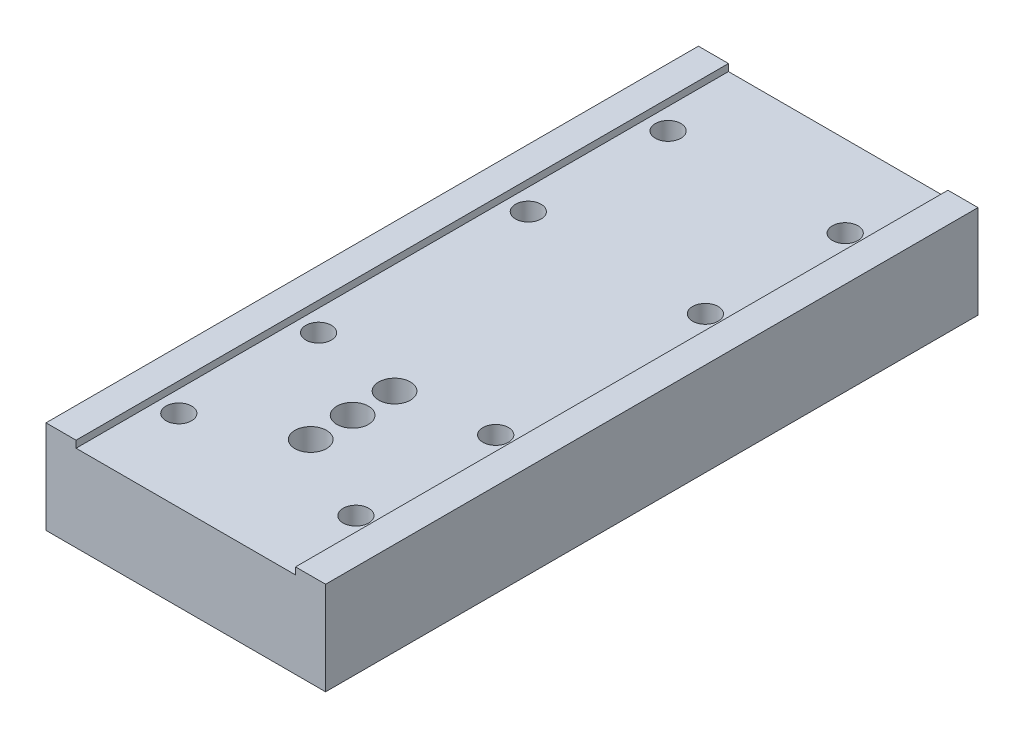
ISO-10303-21;
HEADER;
FILE_DESCRIPTION(('STEP AP214'),'2;1');
FILE_NAME('part.step','',(''),(''),'','','');
FILE_SCHEMA(('AUTOMOTIVE_DESIGN { 1 0 10303 214 1 1 1 1 }'));
ENDSEC;
DATA;
#1=APPLICATION_CONTEXT('core data for automotive mechanical design processes');
#2=APPLICATION_PROTOCOL_DEFINITION('international standard','automotive_design',2000,#1);
#3=PRODUCT_CONTEXT('',#1,'mechanical');
#4=PRODUCT('Part','Part','',(#3));
#5=PRODUCT_RELATED_PRODUCT_CATEGORY('part','',(#4));
#6=PRODUCT_DEFINITION_FORMATION('','',#4);
#7=PRODUCT_DEFINITION_CONTEXT('part definition',#1,'design');
#8=PRODUCT_DEFINITION('design','',#6,#7);
#9=PRODUCT_DEFINITION_SHAPE('','',#8);
#10=(LENGTH_UNIT() NAMED_UNIT(*) SI_UNIT(.MILLI.,.METRE.));
#11=(NAMED_UNIT(*) PLANE_ANGLE_UNIT() SI_UNIT($,.RADIAN.));
#12=(NAMED_UNIT(*) SI_UNIT($,.STERADIAN.) SOLID_ANGLE_UNIT());
#13=UNCERTAINTY_MEASURE_WITH_UNIT(LENGTH_MEASURE(1.E-05),#10,'distance_accuracy_value','');
#14=(GEOMETRIC_REPRESENTATION_CONTEXT(3) GLOBAL_UNCERTAINTY_ASSIGNED_CONTEXT((#13)) GLOBAL_UNIT_ASSIGNED_CONTEXT((#10,
#11,#12)) REPRESENTATION_CONTEXT('',''));
#15=CARTESIAN_POINT('',(0.,0.,0.));
#16=DIRECTION('',(0.,0.,1.));
#17=DIRECTION('',(1.,0.,0.));
#18=AXIS2_PLACEMENT_3D('',#15,#16,#17);
#19=CARTESIAN_POINT('',(0.,0.,43.2));
#20=DIRECTION('',(0.,-1.,0.));
#21=DIRECTION('',(0.,0.,-1.));
#22=AXIS2_PLACEMENT_3D('',#19,#20,#21);
#23=CONICAL_SURFACE('',#22,4.025,0.785398163397446);
#24=CARTESIAN_POINT('',(0.,0.625000000000014,43.2));
#25=DIRECTION('',(0.,-1.,0.));
#26=DIRECTION('',(0.,0.,-1.));
#27=AXIS2_PLACEMENT_3D('',#24,#25,#26);
#28=CIRCLE('',#27,3.4);
#29=CARTESIAN_POINT('',(0.,0.625000000000014,39.8));
#30=VERTEX_POINT('',#29);
#31=EDGE_CURVE('E11',#30,#30,#28,.T.);
#32=ORIENTED_EDGE('',*,*,#31,.F.);
#33=EDGE_LOOP('',(#32));
#34=FACE_BOUND('',#33,.T.);
#35=CARTESIAN_POINT('',(0.,0.,43.2));
#36=DIRECTION('',(0.,-1.,0.));
#37=DIRECTION('',(0.,0.,-1.));
#38=AXIS2_PLACEMENT_3D('',#35,#36,#37);
#39=CIRCLE('',#38,4.025);
#40=CARTESIAN_POINT('',(0.,0.,39.175));
#41=VERTEX_POINT('',#40);
#42=EDGE_CURVE('E1143',#41,#41,#39,.T.);
#43=ORIENTED_EDGE('',*,*,#42,.T.);
#44=EDGE_LOOP('',(#43));
#45=FACE_BOUND('',#44,.T.);
#46=ADVANCED_FACE('F17',(#34,#45),#23,.F.);
#47=CARTESIAN_POINT('',(0.,0.,43.2));
#48=DIRECTION('',(0.,-1.,0.));
#49=DIRECTION('',(0.,0.,-1.));
#50=AXIS2_PLACEMENT_3D('',#47,#48,#49);
#51=CYLINDRICAL_SURFACE('',#50,3.4);
#52=ORIENTED_EDGE('',*,*,#31,.T.);
#53=EDGE_LOOP('',(#52));
#54=FACE_BOUND('',#53,.T.);
#55=CARTESIAN_POINT('',(0.,18.5,43.2));
#56=DIRECTION('',(0.,-1.,0.));
#57=DIRECTION('',(0.,0.,-1.));
#58=AXIS2_PLACEMENT_3D('',#55,#56,#57);
#59=CIRCLE('',#58,3.4);
#60=CARTESIAN_POINT('',(0.,18.5,39.8));
#61=VERTEX_POINT('',#60);
#62=EDGE_CURVE('E1178',#61,#61,#59,.T.);
#63=ORIENTED_EDGE('',*,*,#62,.F.);
#64=EDGE_LOOP('',(#63));
#65=FACE_BOUND('',#64,.T.);
#66=ADVANCED_FACE('F693',(#54,#65),#51,.F.);
#67=CARTESIAN_POINT('',(0.,0.,25.2));
#68=DIRECTION('',(0.,-1.,0.));
#69=DIRECTION('',(0.,0.,-1.));
#70=AXIS2_PLACEMENT_3D('',#67,#68,#69);
#71=CONICAL_SURFACE('',#70,4.025,0.785398163397446);
#72=CARTESIAN_POINT('',(0.,0.625000000000014,25.2));
#73=DIRECTION('',(0.,-1.,0.));
#74=DIRECTION('',(0.,0.,-1.));
#75=AXIS2_PLACEMENT_3D('',#72,#73,#74);
#76=CIRCLE('',#75,3.4);
#77=CARTESIAN_POINT('',(0.,0.625000000000014,21.8));
#78=VERTEX_POINT('',#77);
#79=EDGE_CURVE('E20',#78,#78,#76,.T.);
#80=ORIENTED_EDGE('',*,*,#79,.F.);
#81=EDGE_LOOP('',(#80));
#82=FACE_BOUND('',#81,.T.);
#83=CARTESIAN_POINT('',(0.,0.,25.2));
#84=DIRECTION('',(0.,-1.,0.));
#85=DIRECTION('',(0.,0.,-1.));
#86=AXIS2_PLACEMENT_3D('',#83,#84,#85);
#87=CIRCLE('',#86,4.025);
#88=CARTESIAN_POINT('',(0.,0.,21.175));
#89=VERTEX_POINT('',#88);
#90=EDGE_CURVE('E1146',#89,#89,#87,.T.);
#91=ORIENTED_EDGE('',*,*,#90,.T.);
#92=EDGE_LOOP('',(#91));
#93=FACE_BOUND('',#92,.T.);
#94=ADVANCED_FACE('F683',(#82,#93),#71,.F.);
#95=CARTESIAN_POINT('',(0.,0.,25.2));
#96=DIRECTION('',(0.,-1.,0.));
#97=DIRECTION('',(0.,0.,-1.));
#98=AXIS2_PLACEMENT_3D('',#95,#96,#97);
#99=CYLINDRICAL_SURFACE('',#98,3.4);
#100=ORIENTED_EDGE('',*,*,#79,.T.);
#101=EDGE_LOOP('',(#100));
#102=FACE_BOUND('',#101,.T.);
#103=CARTESIAN_POINT('',(0.,18.5,25.2));
#104=DIRECTION('',(0.,-1.,0.));
#105=DIRECTION('',(0.,0.,-1.));
#106=AXIS2_PLACEMENT_3D('',#103,#104,#105);
#107=CIRCLE('',#106,3.4);
#108=CARTESIAN_POINT('',(0.,18.5,21.8));
#109=VERTEX_POINT('',#108);
#110=EDGE_CURVE('E1180',#109,#109,#107,.T.);
#111=ORIENTED_EDGE('',*,*,#110,.F.);
#112=EDGE_LOOP('',(#111));
#113=FACE_BOUND('',#112,.T.);
#114=ADVANCED_FACE('F672',(#102,#113),#99,.F.);
#115=CARTESIAN_POINT('',(0.,0.,34.2));
#116=DIRECTION('',(0.,-1.,0.));
#117=DIRECTION('',(0.,0.,-1.));
#118=AXIS2_PLACEMENT_3D('',#115,#116,#117);
#119=CONICAL_SURFACE('',#118,4.025,0.785398163397446);
#120=CARTESIAN_POINT('',(0.,0.625000000000014,34.2));
#121=DIRECTION('',(0.,-1.,0.));
#122=DIRECTION('',(0.,0.,-1.));
#123=AXIS2_PLACEMENT_3D('',#120,#121,#122);
#124=CIRCLE('',#123,3.4);
#125=CARTESIAN_POINT('',(0.,0.625000000000014,30.8));
#126=VERTEX_POINT('',#125);
#127=EDGE_CURVE('E265',#126,#126,#124,.T.);
#128=ORIENTED_EDGE('',*,*,#127,.F.);
#129=EDGE_LOOP('',(#128));
#130=FACE_BOUND('',#129,.T.);
#131=CARTESIAN_POINT('',(0.,0.,34.2));
#132=DIRECTION('',(0.,-1.,0.));
#133=DIRECTION('',(0.,0.,-1.));
#134=AXIS2_PLACEMENT_3D('',#131,#132,#133);
#135=CIRCLE('',#134,4.025);
#136=CARTESIAN_POINT('',(0.,0.,30.175));
#137=VERTEX_POINT('',#136);
#138=EDGE_CURVE('E1149',#137,#137,#135,.T.);
#139=ORIENTED_EDGE('',*,*,#138,.T.);
#140=EDGE_LOOP('',(#139));
#141=FACE_BOUND('',#140,.T.);
#142=ADVANCED_FACE('F662',(#130,#141),#119,.F.);
#143=CARTESIAN_POINT('',(0.,0.,34.2));
#144=DIRECTION('',(0.,-1.,0.));
#145=DIRECTION('',(0.,0.,-1.));
#146=AXIS2_PLACEMENT_3D('',#143,#144,#145);
#147=CYLINDRICAL_SURFACE('',#146,3.4);
#148=ORIENTED_EDGE('',*,*,#127,.T.);
#149=EDGE_LOOP('',(#148));
#150=FACE_BOUND('',#149,.T.);
#151=CARTESIAN_POINT('',(0.,18.5,34.2));
#152=DIRECTION('',(0.,-1.,0.));
#153=DIRECTION('',(0.,0.,-1.));
#154=AXIS2_PLACEMENT_3D('',#151,#152,#153);
#155=CIRCLE('',#154,3.4);
#156=CARTESIAN_POINT('',(0.,18.5,30.8));
#157=VERTEX_POINT('',#156);
#158=EDGE_CURVE('E1188',#157,#157,#155,.T.);
#159=ORIENTED_EDGE('',*,*,#158,.F.);
#160=EDGE_LOOP('',(#159));
#161=FACE_BOUND('',#160,.T.);
#162=ADVANCED_FACE('F651',(#150,#161),#147,.F.);
#163=CARTESIAN_POINT('',(-19.,0.,52.5));
#164=DIRECTION('',(0.,-1.,0.));
#165=DIRECTION('',(0.,0.,-1.));
#166=AXIS2_PLACEMENT_3D('',#163,#164,#165);
#167=CYLINDRICAL_SURFACE('',#166,5.5);
#168=CARTESIAN_POINT('',(-19.,10.,52.5));
#169=DIRECTION('',(0.,-1.,0.));
#170=DIRECTION('',(0.,0.,-1.));
#171=AXIS2_PLACEMENT_3D('',#168,#169,#170);
#172=CIRCLE('',#171,5.5);
#173=CARTESIAN_POINT('',(-19.,10.,47.));
#174=VERTEX_POINT('',#173);
#175=EDGE_CURVE('E80',#174,#174,#172,.T.);
#176=ORIENTED_EDGE('',*,*,#175,.F.);
#177=EDGE_LOOP('',(#176));
#178=FACE_BOUND('',#177,.T.);
#179=CARTESIAN_POINT('',(-19.,0.,52.5));
#180=DIRECTION('',(0.,-1.,0.));
#181=DIRECTION('',(0.,0.,-1.));
#182=AXIS2_PLACEMENT_3D('',#179,#180,#181);
#183=CIRCLE('',#182,5.5);
#184=CARTESIAN_POINT('',(-19.,0.,47.));
#185=VERTEX_POINT('',#184);
#186=EDGE_CURVE('E1155',#185,#185,#183,.T.);
#187=ORIENTED_EDGE('',*,*,#186,.T.);
#188=EDGE_LOOP('',(#187));
#189=FACE_BOUND('',#188,.T.);
#190=ADVANCED_FACE('F640',(#178,#189),#167,.F.);
#191=CARTESIAN_POINT('',(-16.25,10.,52.5));
#192=DIRECTION('',(0.,1.,0.));
#193=DIRECTION('',(1.,0.,0.));
#194=AXIS2_PLACEMENT_3D('',#191,#192,#193);
#195=PLANE('',#194);
#196=CARTESIAN_POINT('',(-19.,10.,52.5));
#197=DIRECTION('',(0.,-1.,0.));
#198=DIRECTION('',(0.,0.,-1.));
#199=AXIS2_PLACEMENT_3D('',#196,#197,#198);
#200=CIRCLE('',#199,2.75);
#201=CARTESIAN_POINT('',(-19.,10.,49.75));
#202=VERTEX_POINT('',#201);
#203=EDGE_CURVE('E90',#202,#202,#200,.T.);
#204=ORIENTED_EDGE('',*,*,#203,.F.);
#205=EDGE_LOOP('',(#204));
#206=FACE_BOUND('',#205,.T.);
#207=ORIENTED_EDGE('',*,*,#175,.T.);
#208=EDGE_LOOP('',(#207));
#209=FACE_BOUND('',#208,.T.);
#210=ADVANCED_FACE('F631',(#206,#209),#195,.F.);
#211=CARTESIAN_POINT('',(-19.,0.,52.5));
#212=DIRECTION('',(0.,-1.,0.));
#213=DIRECTION('',(0.,0.,-1.));
#214=AXIS2_PLACEMENT_3D('',#211,#212,#213);
#215=CYLINDRICAL_SURFACE('',#214,2.75);
#216=ORIENTED_EDGE('',*,*,#203,.T.);
#217=EDGE_LOOP('',(#216));
#218=FACE_BOUND('',#217,.T.);
#219=CARTESIAN_POINT('',(-19.,18.5,52.5));
#220=DIRECTION('',(0.,-1.,0.));
#221=DIRECTION('',(0.,0.,-1.));
#222=AXIS2_PLACEMENT_3D('',#219,#220,#221);
#223=CIRCLE('',#222,2.75);
#224=CARTESIAN_POINT('',(-19.,18.5,49.75));
#225=VERTEX_POINT('',#224);
#226=EDGE_CURVE('E1189',#225,#225,#223,.T.);
#227=ORIENTED_EDGE('',*,*,#226,.F.);
#228=EDGE_LOOP('',(#227));
#229=FACE_BOUND('',#228,.T.);
#230=ADVANCED_FACE('F620',(#218,#229),#215,.F.);
#231=CARTESIAN_POINT('',(19.,0.,22.5));
#232=DIRECTION('',(0.,-1.,0.));
#233=DIRECTION('',(0.,0.,-1.));
#234=AXIS2_PLACEMENT_3D('',#231,#232,#233);
#235=CYLINDRICAL_SURFACE('',#234,5.5);
#236=CARTESIAN_POINT('',(19.,10.,22.5));
#237=DIRECTION('',(0.,-1.,0.));
#238=DIRECTION('',(0.,0.,-1.));
#239=AXIS2_PLACEMENT_3D('',#236,#237,#238);
#240=CIRCLE('',#239,5.5);
#241=CARTESIAN_POINT('',(19.,10.,17.));
#242=VERTEX_POINT('',#241);
#243=EDGE_CURVE('E261',#242,#242,#240,.T.);
#244=ORIENTED_EDGE('',*,*,#243,.F.);
#245=EDGE_LOOP('',(#244));
#246=FACE_BOUND('',#245,.T.);
#247=CARTESIAN_POINT('',(19.,0.,22.5));
#248=DIRECTION('',(0.,-1.,0.));
#249=DIRECTION('',(0.,0.,-1.));
#250=AXIS2_PLACEMENT_3D('',#247,#248,#249);
#251=CIRCLE('',#250,5.5);
#252=CARTESIAN_POINT('',(19.,0.,17.));
#253=VERTEX_POINT('',#252);
#254=EDGE_CURVE('E1158',#253,#253,#251,.T.);
#255=ORIENTED_EDGE('',*,*,#254,.T.);
#256=EDGE_LOOP('',(#255));
#257=FACE_BOUND('',#256,.T.);
#258=ADVANCED_FACE('F609',(#246,#257),#235,.F.);
#259=CARTESIAN_POINT('',(21.75,10.,22.5));
#260=DIRECTION('',(0.,1.,0.));
#261=DIRECTION('',(1.,0.,0.));
#262=AXIS2_PLACEMENT_3D('',#259,#260,#261);
#263=PLANE('',#262);
#264=CARTESIAN_POINT('',(19.,10.,22.5));
#265=DIRECTION('',(0.,-1.,0.));
#266=DIRECTION('',(0.,0.,-1.));
#267=AXIS2_PLACEMENT_3D('',#264,#265,#266);
#268=CIRCLE('',#267,2.75);
#269=CARTESIAN_POINT('',(19.,10.,19.75));
#270=VERTEX_POINT('',#269);
#271=EDGE_CURVE('E258',#270,#270,#268,.T.);
#272=ORIENTED_EDGE('',*,*,#271,.F.);
#273=EDGE_LOOP('',(#272));
#274=FACE_BOUND('',#273,.T.);
#275=ORIENTED_EDGE('',*,*,#243,.T.);
#276=EDGE_LOOP('',(#275));
#277=FACE_BOUND('',#276,.T.);
#278=ADVANCED_FACE('F598',(#274,#277),#263,.F.);
#279=CARTESIAN_POINT('',(19.,0.,22.5));
#280=DIRECTION('',(0.,-1.,0.));
#281=DIRECTION('',(0.,0.,-1.));
#282=AXIS2_PLACEMENT_3D('',#279,#280,#281);
#283=CYLINDRICAL_SURFACE('',#282,2.75);
#284=ORIENTED_EDGE('',*,*,#271,.T.);
#285=EDGE_LOOP('',(#284));
#286=FACE_BOUND('',#285,.T.);
#287=CARTESIAN_POINT('',(19.,18.5,22.5));
#288=DIRECTION('',(0.,-1.,0.));
#289=DIRECTION('',(0.,0.,-1.));
#290=AXIS2_PLACEMENT_3D('',#287,#288,#289);
#291=CIRCLE('',#290,2.75);
#292=CARTESIAN_POINT('',(19.,18.5,19.75));
#293=VERTEX_POINT('',#292);
#294=EDGE_CURVE('E1192',#293,#293,#291,.T.);
#295=ORIENTED_EDGE('',*,*,#294,.F.);
#296=EDGE_LOOP('',(#295));
#297=FACE_BOUND('',#296,.T.);
#298=ADVANCED_FACE('F587',(#286,#297),#283,.F.);
#299=CARTESIAN_POINT('',(19.,0.,52.5));
#300=DIRECTION('',(0.,-1.,0.));
#301=DIRECTION('',(0.,0.,-1.));
#302=AXIS2_PLACEMENT_3D('',#299,#300,#301);
#303=CYLINDRICAL_SURFACE('',#302,5.5);
#304=CARTESIAN_POINT('',(19.,10.,52.5));
#305=DIRECTION('',(0.,-1.,0.));
#306=DIRECTION('',(0.,0.,-1.));
#307=AXIS2_PLACEMENT_3D('',#304,#305,#306);
#308=CIRCLE('',#307,5.5);
#309=CARTESIAN_POINT('',(19.,10.,47.));
#310=VERTEX_POINT('',#309);
#311=EDGE_CURVE('E257',#310,#310,#308,.T.);
#312=ORIENTED_EDGE('',*,*,#311,.F.);
#313=EDGE_LOOP('',(#312));
#314=FACE_BOUND('',#313,.T.);
#315=CARTESIAN_POINT('',(19.,0.,52.5));
#316=DIRECTION('',(0.,-1.,0.));
#317=DIRECTION('',(0.,0.,-1.));
#318=AXIS2_PLACEMENT_3D('',#315,#316,#317);
#319=CIRCLE('',#318,5.5);
#320=CARTESIAN_POINT('',(19.,0.,47.));
#321=VERTEX_POINT('',#320);
#322=EDGE_CURVE('E1159',#321,#321,#319,.T.);
#323=ORIENTED_EDGE('',*,*,#322,.T.);
#324=EDGE_LOOP('',(#323));
#325=FACE_BOUND('',#324,.T.);
#326=ADVANCED_FACE('F576',(#314,#325),#303,.F.);
#327=CARTESIAN_POINT('',(21.75,10.,52.5));
#328=DIRECTION('',(0.,1.,0.));
#329=DIRECTION('',(1.,0.,0.));
#330=AXIS2_PLACEMENT_3D('',#327,#328,#329);
#331=PLANE('',#330);
#332=CARTESIAN_POINT('',(19.,10.,52.5));
#333=DIRECTION('',(0.,-1.,0.));
#334=DIRECTION('',(0.,0.,-1.));
#335=AXIS2_PLACEMENT_3D('',#332,#333,#334);
#336=CIRCLE('',#335,2.75);
#337=CARTESIAN_POINT('',(19.,10.,49.75));
#338=VERTEX_POINT('',#337);
#339=EDGE_CURVE('E254',#338,#338,#336,.T.);
#340=ORIENTED_EDGE('',*,*,#339,.F.);
#341=EDGE_LOOP('',(#340));
#342=FACE_BOUND('',#341,.T.);
#343=ORIENTED_EDGE('',*,*,#311,.T.);
#344=EDGE_LOOP('',(#343));
#345=FACE_BOUND('',#344,.T.);
#346=ADVANCED_FACE('F566',(#342,#345),#331,.F.);
#347=CARTESIAN_POINT('',(19.,0.,52.5));
#348=DIRECTION('',(0.,-1.,0.));
#349=DIRECTION('',(0.,0.,-1.));
#350=AXIS2_PLACEMENT_3D('',#347,#348,#349);
#351=CYLINDRICAL_SURFACE('',#350,2.75);
#352=ORIENTED_EDGE('',*,*,#339,.T.);
#353=EDGE_LOOP('',(#352));
#354=FACE_BOUND('',#353,.T.);
#355=CARTESIAN_POINT('',(19.,18.5,52.5));
#356=DIRECTION('',(0.,-1.,0.));
#357=DIRECTION('',(0.,0.,-1.));
#358=AXIS2_PLACEMENT_3D('',#355,#356,#357);
#359=CIRCLE('',#358,2.75);
#360=CARTESIAN_POINT('',(19.,18.5,49.75));
#361=VERTEX_POINT('',#360);
#362=EDGE_CURVE('E1195',#361,#361,#359,.T.);
#363=ORIENTED_EDGE('',*,*,#362,.F.);
#364=EDGE_LOOP('',(#363));
#365=FACE_BOUND('',#364,.T.);
#366=ADVANCED_FACE('F556',(#354,#365),#351,.F.);
#367=CARTESIAN_POINT('',(-19.,0.,22.5));
#368=DIRECTION('',(0.,-1.,0.));
#369=DIRECTION('',(0.,0.,-1.));
#370=AXIS2_PLACEMENT_3D('',#367,#368,#369);
#371=CYLINDRICAL_SURFACE('',#370,5.5);
#372=CARTESIAN_POINT('',(-19.,10.,22.5));
#373=DIRECTION('',(0.,-1.,0.));
#374=DIRECTION('',(0.,0.,-1.));
#375=AXIS2_PLACEMENT_3D('',#372,#373,#374);
#376=CIRCLE('',#375,5.5);
#377=CARTESIAN_POINT('',(-19.,10.,17.));
#378=VERTEX_POINT('',#377);
#379=EDGE_CURVE('E251',#378,#378,#376,.T.);
#380=ORIENTED_EDGE('',*,*,#379,.F.);
#381=EDGE_LOOP('',(#380));
#382=FACE_BOUND('',#381,.T.);
#383=CARTESIAN_POINT('',(-19.,0.,22.5));
#384=DIRECTION('',(0.,-1.,0.));
#385=DIRECTION('',(0.,0.,-1.));
#386=AXIS2_PLACEMENT_3D('',#383,#384,#385);
#387=CIRCLE('',#386,5.5);
#388=CARTESIAN_POINT('',(-19.,0.,17.));
#389=VERTEX_POINT('',#388);
#390=EDGE_CURVE('E1162',#389,#389,#387,.T.);
#391=ORIENTED_EDGE('',*,*,#390,.T.);
#392=EDGE_LOOP('',(#391));
#393=FACE_BOUND('',#392,.T.);
#394=ADVANCED_FACE('F545',(#382,#393),#371,.F.);
#395=CARTESIAN_POINT('',(-16.25,10.,22.5));
#396=DIRECTION('',(0.,1.,0.));
#397=DIRECTION('',(1.,0.,0.));
#398=AXIS2_PLACEMENT_3D('',#395,#396,#397);
#399=PLANE('',#398);
#400=CARTESIAN_POINT('',(-19.,10.,22.5));
#401=DIRECTION('',(0.,-1.,0.));
#402=DIRECTION('',(0.,0.,-1.));
#403=AXIS2_PLACEMENT_3D('',#400,#401,#402);
#404=CIRCLE('',#403,2.75);
#405=CARTESIAN_POINT('',(-19.,10.,19.75));
#406=VERTEX_POINT('',#405);
#407=EDGE_CURVE('E243',#406,#406,#404,.T.);
#408=ORIENTED_EDGE('',*,*,#407,.F.);
#409=EDGE_LOOP('',(#408));
#410=FACE_BOUND('',#409,.T.);
#411=ORIENTED_EDGE('',*,*,#379,.T.);
#412=EDGE_LOOP('',(#411));
#413=FACE_BOUND('',#412,.T.);
#414=ADVANCED_FACE('F534',(#410,#413),#399,.F.);
#415=CARTESIAN_POINT('',(-19.,0.,22.5));
#416=DIRECTION('',(0.,-1.,0.));
#417=DIRECTION('',(0.,0.,-1.));
#418=AXIS2_PLACEMENT_3D('',#415,#416,#417);
#419=CYLINDRICAL_SURFACE('',#418,2.75);
#420=ORIENTED_EDGE('',*,*,#407,.T.);
#421=EDGE_LOOP('',(#420));
#422=FACE_BOUND('',#421,.T.);
#423=CARTESIAN_POINT('',(-19.,18.5,22.5));
#424=DIRECTION('',(0.,-1.,0.));
#425=DIRECTION('',(0.,0.,-1.));
#426=AXIS2_PLACEMENT_3D('',#423,#424,#425);
#427=CIRCLE('',#426,2.75);
#428=CARTESIAN_POINT('',(-19.,18.5,19.75));
#429=VERTEX_POINT('',#428);
#430=EDGE_CURVE('E1108',#429,#429,#427,.T.);
#431=ORIENTED_EDGE('',*,*,#430,.F.);
#432=EDGE_LOOP('',(#431));
#433=FACE_BOUND('',#432,.T.);
#434=ADVANCED_FACE('F523',(#422,#433),#419,.F.);
#435=CARTESIAN_POINT('',(-19.,0.,-22.5));
#436=DIRECTION('',(0.,-1.,0.));
#437=DIRECTION('',(0.,0.,-1.));
#438=AXIS2_PLACEMENT_3D('',#435,#436,#437);
#439=CYLINDRICAL_SURFACE('',#438,5.5);
#440=CARTESIAN_POINT('',(-19.,10.,-22.5));
#441=DIRECTION('',(0.,-1.,0.));
#442=DIRECTION('',(0.,0.,-1.));
#443=AXIS2_PLACEMENT_3D('',#440,#441,#442);
#444=CIRCLE('',#443,5.5);
#445=CARTESIAN_POINT('',(-19.,10.,-28.));
#446=VERTEX_POINT('',#445);
#447=EDGE_CURVE('E236',#446,#446,#444,.T.);
#448=ORIENTED_EDGE('',*,*,#447,.F.);
#449=EDGE_LOOP('',(#448));
#450=FACE_BOUND('',#449,.T.);
#451=CARTESIAN_POINT('',(-19.,0.,-22.5));
#452=DIRECTION('',(0.,-1.,0.));
#453=DIRECTION('',(0.,0.,-1.));
#454=AXIS2_PLACEMENT_3D('',#451,#452,#453);
#455=CIRCLE('',#454,5.5);
#456=CARTESIAN_POINT('',(-19.,0.,-28.));
#457=VERTEX_POINT('',#456);
#458=EDGE_CURVE('E1165',#457,#457,#455,.T.);
#459=ORIENTED_EDGE('',*,*,#458,.T.);
#460=EDGE_LOOP('',(#459));
#461=FACE_BOUND('',#460,.T.);
#462=ADVANCED_FACE('F513',(#450,#461),#439,.F.);
#463=CARTESIAN_POINT('',(-16.25,10.,-22.5));
#464=DIRECTION('',(0.,1.,0.));
#465=DIRECTION('',(1.,0.,0.));
#466=AXIS2_PLACEMENT_3D('',#463,#464,#465);
#467=PLANE('',#466);
#468=CARTESIAN_POINT('',(-19.,10.,-22.5));
#469=DIRECTION('',(0.,-1.,0.));
#470=DIRECTION('',(0.,0.,-1.));
#471=AXIS2_PLACEMENT_3D('',#468,#469,#470);
#472=CIRCLE('',#471,2.75);
#473=CARTESIAN_POINT('',(-19.,10.,-25.25));
#474=VERTEX_POINT('',#473);
#475=EDGE_CURVE('E231',#474,#474,#472,.T.);
#476=ORIENTED_EDGE('',*,*,#475,.F.);
#477=EDGE_LOOP('',(#476));
#478=FACE_BOUND('',#477,.T.);
#479=ORIENTED_EDGE('',*,*,#447,.T.);
#480=EDGE_LOOP('',(#479));
#481=FACE_BOUND('',#480,.T.);
#482=ADVANCED_FACE('F502',(#478,#481),#467,.F.);
#483=CARTESIAN_POINT('',(-19.,0.,-22.5));
#484=DIRECTION('',(0.,-1.,0.));
#485=DIRECTION('',(0.,0.,-1.));
#486=AXIS2_PLACEMENT_3D('',#483,#484,#485);
#487=CYLINDRICAL_SURFACE('',#486,2.75);
#488=ORIENTED_EDGE('',*,*,#475,.T.);
#489=EDGE_LOOP('',(#488));
#490=FACE_BOUND('',#489,.T.);
#491=CARTESIAN_POINT('',(-19.,18.5,-22.5));
#492=DIRECTION('',(0.,-1.,0.));
#493=DIRECTION('',(0.,0.,-1.));
#494=AXIS2_PLACEMENT_3D('',#491,#492,#493);
#495=CIRCLE('',#494,2.75);
#496=CARTESIAN_POINT('',(-19.,18.5,-25.25));
#497=VERTEX_POINT('',#496);
#498=EDGE_CURVE('E1105',#497,#497,#495,.T.);
#499=ORIENTED_EDGE('',*,*,#498,.F.);
#500=EDGE_LOOP('',(#499));
#501=FACE_BOUND('',#500,.T.);
#502=ADVANCED_FACE('F232',(#490,#501),#487,.F.);
#503=CARTESIAN_POINT('',(19.,0.,-52.5));
#504=DIRECTION('',(0.,-1.,0.));
#505=DIRECTION('',(0.,0.,-1.));
#506=AXIS2_PLACEMENT_3D('',#503,#504,#505);
#507=CYLINDRICAL_SURFACE('',#506,5.5);
#508=CARTESIAN_POINT('',(19.,10.,-52.5));
#509=DIRECTION('',(0.,-1.,0.));
#510=DIRECTION('',(0.,0.,-1.));
#511=AXIS2_PLACEMENT_3D('',#508,#509,#510);
#512=CIRCLE('',#511,5.5);
#513=CARTESIAN_POINT('',(19.,10.,-58.));
#514=VERTEX_POINT('',#513);
#515=EDGE_CURVE('E225',#514,#514,#512,.T.);
#516=ORIENTED_EDGE('',*,*,#515,.F.);
#517=EDGE_LOOP('',(#516));
#518=FACE_BOUND('',#517,.T.);
#519=CARTESIAN_POINT('',(19.,0.,-52.5));
#520=DIRECTION('',(0.,-1.,0.));
#521=DIRECTION('',(0.,0.,-1.));
#522=AXIS2_PLACEMENT_3D('',#519,#520,#521);
#523=CIRCLE('',#522,5.5);
#524=CARTESIAN_POINT('',(19.,0.,-58.));
#525=VERTEX_POINT('',#524);
#526=EDGE_CURVE('E1154',#525,#525,#523,.T.);
#527=ORIENTED_EDGE('',*,*,#526,.T.);
#528=EDGE_LOOP('',(#527));
#529=FACE_BOUND('',#528,.T.);
#530=ADVANCED_FACE('F481',(#518,#529),#507,.F.);
#531=CARTESIAN_POINT('',(21.75,10.,-52.5));
#532=DIRECTION('',(0.,1.,0.));
#533=DIRECTION('',(1.,0.,0.));
#534=AXIS2_PLACEMENT_3D('',#531,#532,#533);
#535=PLANE('',#534);
#536=CARTESIAN_POINT('',(19.,10.,-52.5));
#537=DIRECTION('',(0.,-1.,0.));
#538=DIRECTION('',(0.,0.,-1.));
#539=AXIS2_PLACEMENT_3D('',#536,#537,#538);
#540=CIRCLE('',#539,2.75);
#541=CARTESIAN_POINT('',(19.,10.,-55.25));
#542=VERTEX_POINT('',#541);
#543=EDGE_CURVE('E245',#542,#542,#540,.T.);
#544=ORIENTED_EDGE('',*,*,#543,.F.);
#545=EDGE_LOOP('',(#544));
#546=FACE_BOUND('',#545,.T.);
#547=ORIENTED_EDGE('',*,*,#515,.T.);
#548=EDGE_LOOP('',(#547));
#549=FACE_BOUND('',#548,.T.);
#550=ADVANCED_FACE('F470',(#546,#549),#535,.F.);
#551=CARTESIAN_POINT('',(19.,0.,-52.5));
#552=DIRECTION('',(0.,-1.,0.));
#553=DIRECTION('',(0.,0.,-1.));
#554=AXIS2_PLACEMENT_3D('',#551,#552,#553);
#555=CYLINDRICAL_SURFACE('',#554,2.75);
#556=ORIENTED_EDGE('',*,*,#543,.T.);
#557=EDGE_LOOP('',(#556));
#558=FACE_BOUND('',#557,.T.);
#559=CARTESIAN_POINT('',(19.,18.5,-52.5));
#560=DIRECTION('',(0.,-1.,0.));
#561=DIRECTION('',(0.,0.,-1.));
#562=AXIS2_PLACEMENT_3D('',#559,#560,#561);
#563=CIRCLE('',#562,2.75);
#564=CARTESIAN_POINT('',(19.,18.5,-55.25));
#565=VERTEX_POINT('',#564);
#566=EDGE_CURVE('E1107',#565,#565,#563,.T.);
#567=ORIENTED_EDGE('',*,*,#566,.F.);
#568=EDGE_LOOP('',(#567));
#569=FACE_BOUND('',#568,.T.);
#570=ADVANCED_FACE('F458',(#558,#569),#555,.F.);
#571=CARTESIAN_POINT('',(19.,0.,-22.5));
#572=DIRECTION('',(0.,-1.,0.));
#573=DIRECTION('',(0.,0.,-1.));
#574=AXIS2_PLACEMENT_3D('',#571,#572,#573);
#575=CYLINDRICAL_SURFACE('',#574,5.5);
#576=CARTESIAN_POINT('',(19.,10.,-22.5));
#577=DIRECTION('',(0.,-1.,0.));
#578=DIRECTION('',(0.,0.,-1.));
#579=AXIS2_PLACEMENT_3D('',#576,#577,#578);
#580=CIRCLE('',#579,5.5);
#581=CARTESIAN_POINT('',(19.,10.,-28.));
#582=VERTEX_POINT('',#581);
#583=EDGE_CURVE('E248',#582,#582,#580,.T.);
#584=ORIENTED_EDGE('',*,*,#583,.F.);
#585=EDGE_LOOP('',(#584));
#586=FACE_BOUND('',#585,.T.);
#587=CARTESIAN_POINT('',(19.,0.,-22.5));
#588=DIRECTION('',(0.,-1.,0.));
#589=DIRECTION('',(0.,0.,-1.));
#590=AXIS2_PLACEMENT_3D('',#587,#588,#589);
#591=CIRCLE('',#590,5.5);
#592=CARTESIAN_POINT('',(19.,0.,-28.));
#593=VERTEX_POINT('',#592);
#594=EDGE_CURVE('E1150',#593,#593,#591,.T.);
#595=ORIENTED_EDGE('',*,*,#594,.T.);
#596=EDGE_LOOP('',(#595));
#597=FACE_BOUND('',#596,.T.);
#598=ADVANCED_FACE('F448',(#586,#597),#575,.F.);
#599=CARTESIAN_POINT('',(21.75,10.,-22.5));
#600=DIRECTION('',(0.,1.,0.));
#601=DIRECTION('',(1.,0.,0.));
#602=AXIS2_PLACEMENT_3D('',#599,#600,#601);
#603=PLANE('',#602);
#604=CARTESIAN_POINT('',(19.,10.,-22.5));
#605=DIRECTION('',(0.,-1.,0.));
#606=DIRECTION('',(0.,0.,-1.));
#607=AXIS2_PLACEMENT_3D('',#604,#605,#606);
#608=CIRCLE('',#607,2.75);
#609=CARTESIAN_POINT('',(19.,10.,-25.25));
#610=VERTEX_POINT('',#609);
#611=EDGE_CURVE('E1182',#610,#610,#608,.T.);
#612=ORIENTED_EDGE('',*,*,#611,.F.);
#613=EDGE_LOOP('',(#612));
#614=FACE_BOUND('',#613,.T.);
#615=ORIENTED_EDGE('',*,*,#583,.T.);
#616=EDGE_LOOP('',(#615));
#617=FACE_BOUND('',#616,.T.);
#618=ADVANCED_FACE('F437',(#614,#617),#603,.F.);
#619=CARTESIAN_POINT('',(19.,0.,-22.5));
#620=DIRECTION('',(0.,-1.,0.));
#621=DIRECTION('',(0.,0.,-1.));
#622=AXIS2_PLACEMENT_3D('',#619,#620,#621);
#623=CYLINDRICAL_SURFACE('',#622,2.75);
#624=ORIENTED_EDGE('',*,*,#611,.T.);
#625=EDGE_LOOP('',(#624));
#626=FACE_BOUND('',#625,.T.);
#627=CARTESIAN_POINT('',(19.,18.5,-22.5));
#628=DIRECTION('',(0.,-1.,0.));
#629=DIRECTION('',(0.,0.,-1.));
#630=AXIS2_PLACEMENT_3D('',#627,#628,#629);
#631=CIRCLE('',#630,2.75);
#632=CARTESIAN_POINT('',(19.,18.5,-25.25));
#633=VERTEX_POINT('',#632);
#634=EDGE_CURVE('E1202',#633,#633,#631,.T.);
#635=ORIENTED_EDGE('',*,*,#634,.F.);
#636=EDGE_LOOP('',(#635));
#637=FACE_BOUND('',#636,.T.);
#638=ADVANCED_FACE('F426',(#626,#637),#623,.F.);
#639=CARTESIAN_POINT('',(-19.,0.,-52.5));
#640=DIRECTION('',(0.,-1.,0.));
#641=DIRECTION('',(0.,0.,-1.));
#642=AXIS2_PLACEMENT_3D('',#639,#640,#641);
#643=CYLINDRICAL_SURFACE('',#642,5.5);
#644=CARTESIAN_POINT('',(-19.,10.,-52.5));
#645=DIRECTION('',(0.,-1.,0.));
#646=DIRECTION('',(0.,0.,-1.));
#647=AXIS2_PLACEMENT_3D('',#644,#645,#646);
#648=CIRCLE('',#647,5.5);
#649=CARTESIAN_POINT('',(-19.,10.,-58.));
#650=VERTEX_POINT('',#649);
#651=EDGE_CURVE('E1185',#650,#650,#648,.T.);
#652=ORIENTED_EDGE('',*,*,#651,.F.);
#653=EDGE_LOOP('',(#652));
#654=FACE_BOUND('',#653,.T.);
#655=CARTESIAN_POINT('',(-19.,0.,-52.5));
#656=DIRECTION('',(0.,-1.,0.));
#657=DIRECTION('',(0.,0.,-1.));
#658=AXIS2_PLACEMENT_3D('',#655,#656,#657);
#659=CIRCLE('',#658,5.5);
#660=CARTESIAN_POINT('',(-19.,0.,-58.));
#661=VERTEX_POINT('',#660);
#662=EDGE_CURVE('E1153',#661,#661,#659,.T.);
#663=ORIENTED_EDGE('',*,*,#662,.T.);
#664=EDGE_LOOP('',(#663));
#665=FACE_BOUND('',#664,.T.);
#666=ADVANCED_FACE('F416',(#654,#665),#643,.F.);
#667=CARTESIAN_POINT('',(-16.25,10.,-52.5));
#668=DIRECTION('',(0.,1.,0.));
#669=DIRECTION('',(1.,0.,0.));
#670=AXIS2_PLACEMENT_3D('',#667,#668,#669);
#671=PLANE('',#670);
#672=CARTESIAN_POINT('',(-19.,10.,-52.5));
#673=DIRECTION('',(0.,-1.,0.));
#674=DIRECTION('',(0.,0.,-1.));
#675=AXIS2_PLACEMENT_3D('',#672,#673,#674);
#676=CIRCLE('',#675,2.75);
#677=CARTESIAN_POINT('',(-19.,10.,-55.25));
#678=VERTEX_POINT('',#677);
#679=EDGE_CURVE('E1208',#678,#678,#676,.T.);
#680=ORIENTED_EDGE('',*,*,#679,.F.);
#681=EDGE_LOOP('',(#680));
#682=FACE_BOUND('',#681,.T.);
#683=ORIENTED_EDGE('',*,*,#651,.T.);
#684=EDGE_LOOP('',(#683));
#685=FACE_BOUND('',#684,.T.);
#686=ADVANCED_FACE('F406',(#682,#685),#671,.F.);
#687=CARTESIAN_POINT('',(-19.,0.,-52.5));
#688=DIRECTION('',(0.,-1.,0.));
#689=DIRECTION('',(0.,0.,-1.));
#690=AXIS2_PLACEMENT_3D('',#687,#688,#689);
#691=CYLINDRICAL_SURFACE('',#690,2.75);
#692=ORIENTED_EDGE('',*,*,#679,.T.);
#693=EDGE_LOOP('',(#692));
#694=FACE_BOUND('',#693,.T.);
#695=CARTESIAN_POINT('',(-19.,18.5,-52.5));
#696=DIRECTION('',(0.,-1.,0.));
#697=DIRECTION('',(0.,0.,-1.));
#698=AXIS2_PLACEMENT_3D('',#695,#696,#697);
#699=CIRCLE('',#698,2.75);
#700=CARTESIAN_POINT('',(-19.,18.5,-55.25));
#701=VERTEX_POINT('',#700);
#702=EDGE_CURVE('E1205',#701,#701,#699,.T.);
#703=ORIENTED_EDGE('',*,*,#702,.F.);
#704=EDGE_LOOP('',(#703));
#705=FACE_BOUND('',#704,.T.);
#706=ADVANCED_FACE('F395',(#694,#705),#691,.F.);
#707=CARTESIAN_POINT('',(0.,18.5,0.));
#708=DIRECTION('',(0.,-1.,0.));
#709=DIRECTION('',(0.,0.,-1.));
#710=AXIS2_PLACEMENT_3D('',#707,#708,#709);
#711=PLANE('',#710);
#712=ORIENTED_EDGE('',*,*,#702,.T.);
#713=EDGE_LOOP('',(#712));
#714=FACE_BOUND('',#713,.T.);
#715=ORIENTED_EDGE('',*,*,#634,.T.);
#716=EDGE_LOOP('',(#715));
#717=FACE_BOUND('',#716,.T.);
#718=ORIENTED_EDGE('',*,*,#566,.T.);
#719=EDGE_LOOP('',(#718));
#720=FACE_BOUND('',#719,.T.);
#721=ORIENTED_EDGE('',*,*,#498,.T.);
#722=EDGE_LOOP('',(#721));
#723=FACE_BOUND('',#722,.T.);
#724=ORIENTED_EDGE('',*,*,#430,.T.);
#725=EDGE_LOOP('',(#724));
#726=FACE_BOUND('',#725,.T.);
#727=ORIENTED_EDGE('',*,*,#362,.T.);
#728=EDGE_LOOP('',(#727));
#729=FACE_BOUND('',#728,.T.);
#730=ORIENTED_EDGE('',*,*,#294,.T.);
#731=EDGE_LOOP('',(#730));
#732=FACE_BOUND('',#731,.T.);
#733=ORIENTED_EDGE('',*,*,#226,.T.);
#734=EDGE_LOOP('',(#733));
#735=FACE_BOUND('',#734,.T.);
#736=ORIENTED_EDGE('',*,*,#158,.T.);
#737=EDGE_LOOP('',(#736));
#738=FACE_BOUND('',#737,.T.);
#739=ORIENTED_EDGE('',*,*,#110,.T.);
#740=EDGE_LOOP('',(#739));
#741=FACE_BOUND('',#740,.T.);
#742=ORIENTED_EDGE('',*,*,#62,.T.);
#743=EDGE_LOOP('',(#742));
#744=FACE_BOUND('',#743,.T.);
#745=DIRECTION('',(0.,0.,1.));
#746=VECTOR('',#745,1.);
#747=CARTESIAN_POINT('',(-23.55,18.5,-70.));
#748=LINE('',#747,#746);
#749=CARTESIAN_POINT('',(-23.55,18.5,-70.));
#750=VERTEX_POINT('',#749);
#751=CARTESIAN_POINT('',(-23.55,18.5,70.));
#752=VERTEX_POINT('',#751);
#753=EDGE_CURVE('E1172',#750,#752,#748,.T.);
#754=ORIENTED_EDGE('',*,*,#753,.T.);
#755=DIRECTION('',(1.,0.,0.));
#756=VECTOR('',#755,1.);
#757=CARTESIAN_POINT('',(23.55,18.5,70.));
#758=LINE('',#757,#756);
#759=CARTESIAN_POINT('',(23.55,18.5,70.));
#760=VERTEX_POINT('',#759);
#761=EDGE_CURVE('E1101',#752,#760,#758,.T.);
#762=ORIENTED_EDGE('',*,*,#761,.T.);
#763=DIRECTION('',(0.,0.,-1.));
#764=VECTOR('',#763,1.);
#765=CARTESIAN_POINT('',(23.55,18.5,-70.));
#766=LINE('',#765,#764);
#767=CARTESIAN_POINT('',(23.55,18.5,-70.));
#768=VERTEX_POINT('',#767);
#769=EDGE_CURVE('E1175',#760,#768,#766,.T.);
#770=ORIENTED_EDGE('',*,*,#769,.T.);
#771=DIRECTION('',(-1.,0.,0.));
#772=VECTOR('',#771,1.);
#773=CARTESIAN_POINT('',(23.55,18.5,-70.));
#774=LINE('',#773,#772);
#775=EDGE_CURVE('E1124',#768,#750,#774,.T.);
#776=ORIENTED_EDGE('',*,*,#775,.T.);
#777=EDGE_LOOP('',(#754,#762,#770,#776));
#778=FACE_BOUND('',#777,.T.);
#779=ADVANCED_FACE('F385',(#714,#717,#720,#723,#726,#729,#732,#735,#738,#741,#744,#778),#711,.F.);
#780=CARTESIAN_POINT('',(23.55,18.5,-70.));
#781=DIRECTION('',(1.,0.,0.));
#782=DIRECTION('',(0.,1.,0.));
#783=AXIS2_PLACEMENT_3D('',#780,#781,#782);
#784=PLANE('',#783);
#785=DIRECTION('',(0.,0.,-1.));
#786=VECTOR('',#785,1.);
#787=CARTESIAN_POINT('',(23.55,20.,-70.));
#788=LINE('',#787,#786);
#789=CARTESIAN_POINT('',(23.55,20.,70.));
#790=VERTEX_POINT('',#789);
#791=CARTESIAN_POINT('',(23.55,20.,-70.));
#792=VERTEX_POINT('',#791);
#793=EDGE_CURVE('E1140',#790,#792,#788,.T.);
#794=ORIENTED_EDGE('',*,*,#793,.T.);
#795=DIRECTION('',(0.,1.,0.));
#796=VECTOR('',#795,1.);
#797=CARTESIAN_POINT('',(23.55,18.5,-70.));
#798=LINE('',#797,#796);
#799=EDGE_CURVE('E1128',#768,#792,#798,.T.);
#800=ORIENTED_EDGE('',*,*,#799,.F.);
#801=ORIENTED_EDGE('',*,*,#769,.F.);
#802=DIRECTION('',(0.,1.,0.));
#803=VECTOR('',#802,1.);
#804=CARTESIAN_POINT('',(23.55,18.5,70.));
#805=LINE('',#804,#803);
#806=EDGE_CURVE('E1080',#760,#790,#805,.T.);
#807=ORIENTED_EDGE('',*,*,#806,.T.);
#808=EDGE_LOOP('',(#794,#800,#801,#807));
#809=FACE_BOUND('',#808,.T.);
#810=ADVANCED_FACE('F373',(#809),#784,.F.);
#811=CARTESIAN_POINT('',(-23.55,18.5,-70.));
#812=DIRECTION('',(-1.,0.,0.));
#813=DIRECTION('',(0.,0.,1.));
#814=AXIS2_PLACEMENT_3D('',#811,#812,#813);
#815=PLANE('',#814);
#816=DIRECTION('',(0.,0.,1.));
#817=VECTOR('',#816,1.);
#818=CARTESIAN_POINT('',(-23.55,20.,-70.));
#819=LINE('',#818,#817);
#820=CARTESIAN_POINT('',(-23.55,20.,-70.));
#821=VERTEX_POINT('',#820);
#822=CARTESIAN_POINT('',(-23.55,20.,70.));
#823=VERTEX_POINT('',#822);
#824=EDGE_CURVE('E1253',#821,#823,#819,.T.);
#825=ORIENTED_EDGE('',*,*,#824,.T.);
#826=DIRECTION('',(0.,1.,0.));
#827=VECTOR('',#826,1.);
#828=CARTESIAN_POINT('',(-23.55,18.5,70.));
#829=LINE('',#828,#827);
#830=EDGE_CURVE('E1096',#752,#823,#829,.T.);
#831=ORIENTED_EDGE('',*,*,#830,.F.);
#832=ORIENTED_EDGE('',*,*,#753,.F.);
#833=DIRECTION('',(0.,1.,0.));
#834=VECTOR('',#833,1.);
#835=CARTESIAN_POINT('',(-23.55,18.5,-70.));
#836=LINE('',#835,#834);
#837=EDGE_CURVE('E1118',#750,#821,#836,.T.);
#838=ORIENTED_EDGE('',*,*,#837,.T.);
#839=EDGE_LOOP('',(#825,#831,#832,#838));
#840=FACE_BOUND('',#839,.T.);
#841=ADVANCED_FACE('F361',(#840),#815,.F.);
#842=CARTESIAN_POINT('',(0.,0.,0.));
#843=DIRECTION('',(0.,1.,0.));
#844=DIRECTION('',(1.,0.,0.));
#845=AXIS2_PLACEMENT_3D('',#842,#843,#844);
#846=PLANE('',#845);
#847=ORIENTED_EDGE('',*,*,#662,.F.);
#848=EDGE_LOOP('',(#847));
#849=FACE_BOUND('',#848,.T.);
#850=ORIENTED_EDGE('',*,*,#594,.F.);
#851=EDGE_LOOP('',(#850));
#852=FACE_BOUND('',#851,.T.);
#853=ORIENTED_EDGE('',*,*,#526,.F.);
#854=EDGE_LOOP('',(#853));
#855=FACE_BOUND('',#854,.T.);
#856=ORIENTED_EDGE('',*,*,#458,.F.);
#857=EDGE_LOOP('',(#856));
#858=FACE_BOUND('',#857,.T.);
#859=ORIENTED_EDGE('',*,*,#390,.F.);
#860=EDGE_LOOP('',(#859));
#861=FACE_BOUND('',#860,.T.);
#862=ORIENTED_EDGE('',*,*,#322,.F.);
#863=EDGE_LOOP('',(#862));
#864=FACE_BOUND('',#863,.T.);
#865=ORIENTED_EDGE('',*,*,#254,.F.);
#866=EDGE_LOOP('',(#865));
#867=FACE_BOUND('',#866,.T.);
#868=ORIENTED_EDGE('',*,*,#186,.F.);
#869=EDGE_LOOP('',(#868));
#870=FACE_BOUND('',#869,.T.);
#871=ORIENTED_EDGE('',*,*,#138,.F.);
#872=EDGE_LOOP('',(#871));
#873=FACE_BOUND('',#872,.T.);
#874=ORIENTED_EDGE('',*,*,#90,.F.);
#875=EDGE_LOOP('',(#874));
#876=FACE_BOUND('',#875,.T.);
#877=ORIENTED_EDGE('',*,*,#42,.F.);
#878=EDGE_LOOP('',(#877));
#879=FACE_BOUND('',#878,.T.);
#880=DIRECTION('',(0.,0.,1.));
#881=VECTOR('',#880,1.);
#882=CARTESIAN_POINT('',(-30.,0.,70.));
#883=LINE('',#882,#881);
#884=CARTESIAN_POINT('',(-30.,0.,-70.));
#885=VERTEX_POINT('',#884);
#886=CARTESIAN_POINT('',(-30.,0.,70.));
#887=VERTEX_POINT('',#886);
#888=EDGE_CURVE('E1251',#885,#887,#883,.T.);
#889=ORIENTED_EDGE('',*,*,#888,.F.);
#890=DIRECTION('',(-1.,0.,0.));
#891=VECTOR('',#890,1.);
#892=CARTESIAN_POINT('',(30.,0.,-70.));
#893=LINE('',#892,#891);
#894=CARTESIAN_POINT('',(30.,0.,-70.));
#895=VERTEX_POINT('',#894);
#896=EDGE_CURVE('E1075',#895,#885,#893,.T.);
#897=ORIENTED_EDGE('',*,*,#896,.F.);
#898=DIRECTION('',(0.,0.,-1.));
#899=VECTOR('',#898,1.);
#900=CARTESIAN_POINT('',(30.,0.,70.));
#901=LINE('',#900,#899);
#902=CARTESIAN_POINT('',(30.,0.,70.));
#903=VERTEX_POINT('',#902);
#904=EDGE_CURVE('E1069',#903,#895,#901,.T.);
#905=ORIENTED_EDGE('',*,*,#904,.F.);
#906=DIRECTION('',(1.,0.,0.));
#907=VECTOR('',#906,1.);
#908=CARTESIAN_POINT('',(30.,0.,70.));
#909=LINE('',#908,#907);
#910=EDGE_CURVE('E1073',#887,#903,#909,.T.);
#911=ORIENTED_EDGE('',*,*,#910,.F.);
#912=EDGE_LOOP('',(#889,#897,#905,#911));
#913=FACE_BOUND('',#912,.T.);
#914=ADVANCED_FACE('F349',(#849,#852,#855,#858,#861,#864,#867,#870,#873,#876,#879,#913),#846,.F.);
#915=CARTESIAN_POINT('',(0.,20.,0.));
#916=DIRECTION('',(0.,1.,0.));
#917=DIRECTION('',(1.,0.,0.));
#918=AXIS2_PLACEMENT_3D('',#915,#916,#917);
#919=PLANE('',#918);
#920=ORIENTED_EDGE('',*,*,#793,.F.);
#921=DIRECTION('',(1.,0.,0.));
#922=VECTOR('',#921,1.);
#923=CARTESIAN_POINT('',(30.,20.,70.));
#924=LINE('',#923,#922);
#925=CARTESIAN_POINT('',(30.,20.,70.));
#926=VERTEX_POINT('',#925);
#927=EDGE_CURVE('E1089',#790,#926,#924,.T.);
#928=ORIENTED_EDGE('',*,*,#927,.T.);
#929=DIRECTION('',(0.,0.,-1.));
#930=VECTOR('',#929,1.);
#931=CARTESIAN_POINT('',(30.,20.,70.));
#932=LINE('',#931,#930);
#933=CARTESIAN_POINT('',(30.,20.,-70.));
#934=VERTEX_POINT('',#933);
#935=EDGE_CURVE('E1085',#926,#934,#932,.T.);
#936=ORIENTED_EDGE('',*,*,#935,.T.);
#937=DIRECTION('',(-1.,0.,0.));
#938=VECTOR('',#937,1.);
#939=CARTESIAN_POINT('',(30.,20.,-70.));
#940=LINE('',#939,#938);
#941=EDGE_CURVE('E1134',#934,#792,#940,.T.);
#942=ORIENTED_EDGE('',*,*,#941,.T.);
#943=EDGE_LOOP('',(#920,#928,#936,#942));
#944=FACE_BOUND('',#943,.T.);
#945=ADVANCED_FACE('F337',(#944),#919,.T.);
#946=CARTESIAN_POINT('',(30.,20.,-70.));
#947=DIRECTION('',(0.,0.,1.));
#948=DIRECTION('',(1.,0.,0.));
#949=AXIS2_PLACEMENT_3D('',#946,#947,#948);
#950=PLANE('',#949);
#951=DIRECTION('',(-1.,0.,0.));
#952=VECTOR('',#951,1.);
#953=CARTESIAN_POINT('',(30.,20.,-70.));
#954=LINE('',#953,#952);
#955=CARTESIAN_POINT('',(-30.,20.,-70.));
#956=VERTEX_POINT('',#955);
#957=EDGE_CURVE('E1257',#821,#956,#954,.T.);
#958=ORIENTED_EDGE('',*,*,#957,.F.);
#959=ORIENTED_EDGE('',*,*,#837,.F.);
#960=ORIENTED_EDGE('',*,*,#775,.F.);
#961=ORIENTED_EDGE('',*,*,#799,.T.);
#962=ORIENTED_EDGE('',*,*,#941,.F.);
#963=DIRECTION('',(0.,-1.,0.));
#964=VECTOR('',#963,1.);
#965=CARTESIAN_POINT('',(30.,20.,-70.));
#966=LINE('',#965,#964);
#967=EDGE_CURVE('E1079',#934,#895,#966,.T.);
#968=ORIENTED_EDGE('',*,*,#967,.T.);
#969=ORIENTED_EDGE('',*,*,#896,.T.);
#970=DIRECTION('',(0.,-1.,0.));
#971=VECTOR('',#970,1.);
#972=CARTESIAN_POINT('',(-30.,20.,-70.));
#973=LINE('',#972,#971);
#974=EDGE_CURVE('E1269',#956,#885,#973,.T.);
#975=ORIENTED_EDGE('',*,*,#974,.F.);
#976=EDGE_LOOP('',(#958,#959,#960,#961,#962,#968,#969,#975));
#977=FACE_BOUND('',#976,.T.);
#978=ADVANCED_FACE('F325',(#977),#950,.F.);
#979=CARTESIAN_POINT('',(30.,20.,70.));
#980=DIRECTION('',(-1.,0.,0.));
#981=DIRECTION('',(0.,0.,1.));
#982=AXIS2_PLACEMENT_3D('',#979,#980,#981);
#983=PLANE('',#982);
#984=ORIENTED_EDGE('',*,*,#904,.T.);
#985=ORIENTED_EDGE('',*,*,#967,.F.);
#986=ORIENTED_EDGE('',*,*,#935,.F.);
#987=DIRECTION('',(0.,-1.,0.));
#988=VECTOR('',#987,1.);
#989=CARTESIAN_POINT('',(30.,20.,70.));
#990=LINE('',#989,#988);
#991=EDGE_CURVE('E1083',#926,#903,#990,.T.);
#992=ORIENTED_EDGE('',*,*,#991,.T.);
#993=EDGE_LOOP('',(#984,#985,#986,#992));
#994=FACE_BOUND('',#993,.T.);
#995=ADVANCED_FACE('F315',(#994),#983,.F.);
#996=CARTESIAN_POINT('',(30.,20.,70.));
#997=DIRECTION('',(0.,0.,-1.));
#998=DIRECTION('',(-1.,0.,0.));
#999=AXIS2_PLACEMENT_3D('',#996,#997,#998);
#1000=PLANE('',#999);
#1001=ORIENTED_EDGE('',*,*,#761,.F.);
#1002=ORIENTED_EDGE('',*,*,#830,.T.);
#1003=DIRECTION('',(1.,0.,0.));
#1004=VECTOR('',#1003,1.);
#1005=CARTESIAN_POINT('',(30.,20.,70.));
#1006=LINE('',#1005,#1004);
#1007=CARTESIAN_POINT('',(-30.,20.,70.));
#1008=VERTEX_POINT('',#1007);
#1009=EDGE_CURVE('E1247',#1008,#823,#1006,.T.);
#1010=ORIENTED_EDGE('',*,*,#1009,.F.);
#1011=DIRECTION('',(0.,-1.,0.));
#1012=VECTOR('',#1011,1.);
#1013=CARTESIAN_POINT('',(-30.,20.,70.));
#1014=LINE('',#1013,#1012);
#1015=EDGE_CURVE('E1093',#1008,#887,#1014,.T.);
#1016=ORIENTED_EDGE('',*,*,#1015,.T.);
#1017=ORIENTED_EDGE('',*,*,#910,.T.);
#1018=ORIENTED_EDGE('',*,*,#991,.F.);
#1019=ORIENTED_EDGE('',*,*,#927,.F.);
#1020=ORIENTED_EDGE('',*,*,#806,.F.);
#1021=EDGE_LOOP('',(#1001,#1002,#1010,#1016,#1017,#1018,#1019,#1020));
#1022=FACE_BOUND('',#1021,.T.);
#1023=ADVANCED_FACE('F304',(#1022),#1000,.F.);
#1024=CARTESIAN_POINT('',(-30.,20.,70.));
#1025=DIRECTION('',(1.,0.,0.));
#1026=DIRECTION('',(0.,1.,0.));
#1027=AXIS2_PLACEMENT_3D('',#1024,#1025,#1026);
#1028=PLANE('',#1027);
#1029=ORIENTED_EDGE('',*,*,#888,.T.);
#1030=ORIENTED_EDGE('',*,*,#1015,.F.);
#1031=DIRECTION('',(0.,0.,1.));
#1032=VECTOR('',#1031,1.);
#1033=CARTESIAN_POINT('',(-30.,20.,70.));
#1034=LINE('',#1033,#1032);
#1035=EDGE_CURVE('E1252',#956,#1008,#1034,.T.);
#1036=ORIENTED_EDGE('',*,*,#1035,.F.);
#1037=ORIENTED_EDGE('',*,*,#974,.T.);
#1038=EDGE_LOOP('',(#1029,#1030,#1036,#1037));
#1039=FACE_BOUND('',#1038,.T.);
#1040=ADVANCED_FACE('F291',(#1039),#1028,.F.);
#1041=CARTESIAN_POINT('',(0.,20.,0.));
#1042=DIRECTION('',(0.,1.,0.));
#1043=DIRECTION('',(1.,0.,0.));
#1044=AXIS2_PLACEMENT_3D('',#1041,#1042,#1043);
#1045=PLANE('',#1044);
#1046=ORIENTED_EDGE('',*,*,#824,.F.);
#1047=ORIENTED_EDGE('',*,*,#957,.T.);
#1048=ORIENTED_EDGE('',*,*,#1035,.T.);
#1049=ORIENTED_EDGE('',*,*,#1009,.T.);
#1050=EDGE_LOOP('',(#1046,#1047,#1048,#1049));
#1051=FACE_BOUND('',#1050,.T.);
#1052=ADVANCED_FACE('F285',(#1051),#1045,.T.);
#1053=CLOSED_SHELL('',(#46,#66,#94,#114,#142,#162,#190,#210,#230,#258,#278,#298,#326,#346,#366,
#394,#414,#434,#462,#482,#502,#530,#550,#570,#598,#618,#638,#666,#686,#706,#779,#810,#841,#914,
#945,#978,#995,#1023,#1040,#1052));
#1054=MANIFOLD_SOLID_BREP('B1',#1053);
#1055=ADVANCED_BREP_SHAPE_REPRESENTATION('',(#18,#1054),#14);
#1056=SHAPE_DEFINITION_REPRESENTATION(#9,#1055);
ENDSEC;
END-ISO-10303-21;
